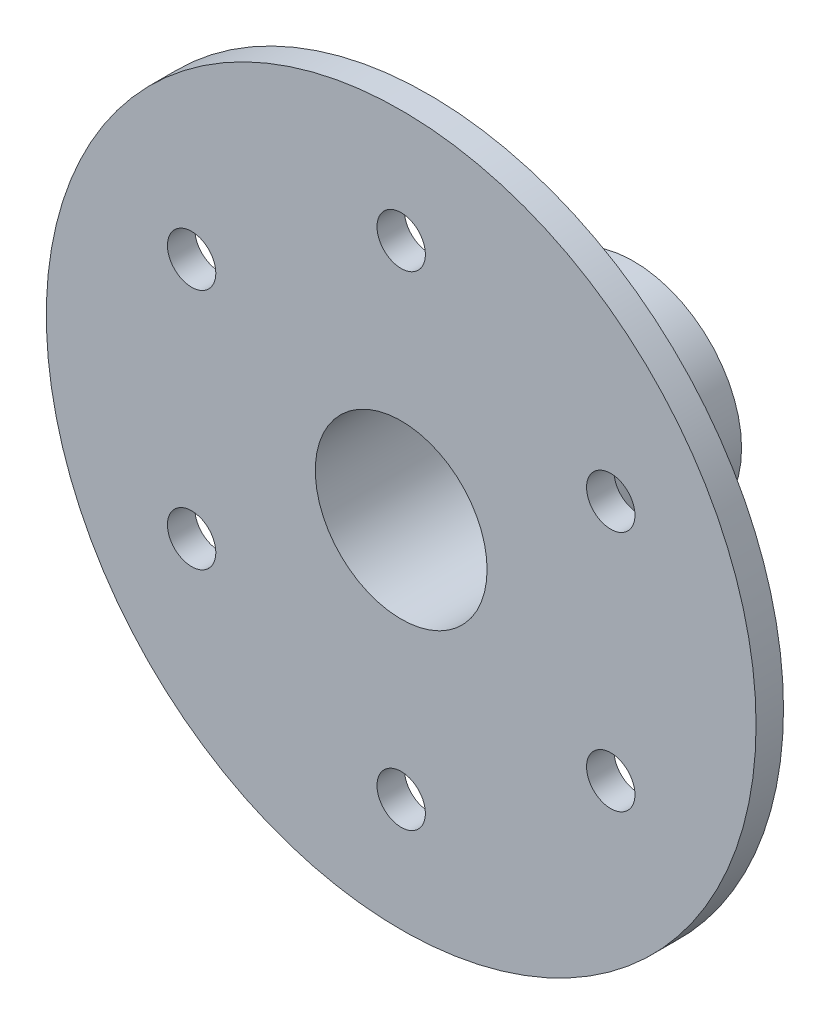
ISO-10303-21;
HEADER;
FILE_DESCRIPTION(('STEP AP214'),'2;1');
FILE_NAME('part.step','',(''),(''),'','','');
FILE_SCHEMA(('AUTOMOTIVE_DESIGN { 1 0 10303 214 1 1 1 1 }'));
ENDSEC;
DATA;
#1=APPLICATION_CONTEXT('core data for automotive mechanical design processes');
#2=APPLICATION_PROTOCOL_DEFINITION('international standard','automotive_design',2000,#1);
#3=PRODUCT_CONTEXT('',#1,'mechanical');
#4=PRODUCT('Part','Part','',(#3));
#5=PRODUCT_RELATED_PRODUCT_CATEGORY('part','',(#4));
#6=PRODUCT_DEFINITION_FORMATION('','',#4);
#7=PRODUCT_DEFINITION_CONTEXT('part definition',#1,'design');
#8=PRODUCT_DEFINITION('design','',#6,#7);
#9=PRODUCT_DEFINITION_SHAPE('','',#8);
#10=(LENGTH_UNIT() NAMED_UNIT(*) SI_UNIT(.MILLI.,.METRE.));
#11=(NAMED_UNIT(*) PLANE_ANGLE_UNIT() SI_UNIT($,.RADIAN.));
#12=(NAMED_UNIT(*) SI_UNIT($,.STERADIAN.) SOLID_ANGLE_UNIT());
#13=UNCERTAINTY_MEASURE_WITH_UNIT(LENGTH_MEASURE(1.E-05),#10,'distance_accuracy_value','');
#14=(GEOMETRIC_REPRESENTATION_CONTEXT(3) GLOBAL_UNCERTAINTY_ASSIGNED_CONTEXT((#13)) GLOBAL_UNIT_ASSIGNED_CONTEXT((#10,
#11,#12)) REPRESENTATION_CONTEXT('',''));
#15=CARTESIAN_POINT('',(0.,0.,0.));
#16=DIRECTION('',(0.,0.,1.));
#17=DIRECTION('',(1.,0.,0.));
#18=AXIS2_PLACEMENT_3D('',#15,#16,#17);
#19=CARTESIAN_POINT('',(0.,0.,0.));
#20=DIRECTION('',(0.,0.,1.));
#21=DIRECTION('',(1.,0.,0.));
#22=AXIS2_PLACEMENT_3D('',#19,#20,#21);
#23=PLANE('',#22);
#24=CARTESIAN_POINT('',(0.,0.,0.));
#25=DIRECTION('',(0.,0.,1.));
#26=DIRECTION('',(1.,0.,0.));
#27=AXIS2_PLACEMENT_3D('',#24,#25,#26);
#28=CIRCLE('',#27,13.4);
#29=CARTESIAN_POINT('',(13.4,0.,0.));
#30=VERTEX_POINT('',#29);
#31=EDGE_CURVE('E36',#30,#30,#28,.T.);
#32=ORIENTED_EDGE('',*,*,#31,.F.);
#33=EDGE_LOOP('',(#32));
#34=FACE_BOUND('',#33,.T.);
#35=CARTESIAN_POINT('',(0.,0.,0.));
#36=DIRECTION('',(0.,0.,1.));
#37=DIRECTION('',(1.,0.,0.));
#38=AXIS2_PLACEMENT_3D('',#35,#36,#37);
#39=CIRCLE('',#38,10.65);
#40=CARTESIAN_POINT('',(10.65,0.,0.));
#41=VERTEX_POINT('',#40);
#42=EDGE_CURVE('E43',#41,#41,#39,.T.);
#43=ORIENTED_EDGE('',*,*,#42,.T.);
#44=EDGE_LOOP('',(#43));
#45=FACE_BOUND('',#44,.T.);
#46=ADVANCED_FACE('F32',(#34,#45),#23,.F.);
#47=CARTESIAN_POINT('',(0.,0.,25.4));
#48=DIRECTION('',(0.,0.,-1.));
#49=DIRECTION('',(-1.,0.,0.));
#50=AXIS2_PLACEMENT_3D('',#47,#48,#49);
#51=CYLINDRICAL_SURFACE('',#50,13.4);
#52=CARTESIAN_POINT('',(0.,0.,25.4));
#53=DIRECTION('',(0.,0.,1.));
#54=DIRECTION('',(1.,0.,0.));
#55=AXIS2_PLACEMENT_3D('',#52,#53,#54);
#56=CIRCLE('',#55,13.4);
#57=CARTESIAN_POINT('',(13.4,0.,25.4));
#58=VERTEX_POINT('',#57);
#59=EDGE_CURVE('E10',#58,#58,#56,.T.);
#60=ORIENTED_EDGE('',*,*,#59,.F.);
#61=EDGE_LOOP('',(#60));
#62=FACE_BOUND('',#61,.T.);
#63=ORIENTED_EDGE('',*,*,#31,.T.);
#64=EDGE_LOOP('',(#63));
#65=FACE_BOUND('',#64,.T.);
#66=ADVANCED_FACE('F34',(#62,#65),#51,.T.);
#67=CARTESIAN_POINT('',(0.,0.,25.4));
#68=DIRECTION('',(0.,0.,-1.));
#69=DIRECTION('',(-1.,0.,0.));
#70=AXIS2_PLACEMENT_3D('',#67,#68,#69);
#71=CYLINDRICAL_SURFACE('',#70,10.65);
#72=ORIENTED_EDGE('',*,*,#42,.F.);
#73=EDGE_LOOP('',(#72));
#74=FACE_BOUND('',#73,.T.);
#75=CARTESIAN_POINT('',(0.,0.,28.8));
#76=DIRECTION('',(0.,0.,1.));
#77=DIRECTION('',(1.,0.,0.));
#78=AXIS2_PLACEMENT_3D('',#75,#76,#77);
#79=CIRCLE('',#78,10.6500000000001);
#80=CARTESIAN_POINT('',(10.6500000000001,0.,28.8));
#81=VERTEX_POINT('',#80);
#82=EDGE_CURVE('E51',#81,#81,#79,.T.);
#83=ORIENTED_EDGE('',*,*,#82,.T.);
#84=EDGE_LOOP('',(#83));
#85=FACE_BOUND('',#84,.T.);
#86=ADVANCED_FACE('F99',(#74,#85),#71,.F.);
#87=CARTESIAN_POINT('',(0.,0.,28.8));
#88=DIRECTION('',(0.,0.,1.));
#89=DIRECTION('',(1.,0.,0.));
#90=AXIS2_PLACEMENT_3D('',#87,#88,#89);
#91=PLANE('',#90);
#92=CARTESIAN_POINT('',(-25.98076211353,-15.0000000000015,28.8));
#93=DIRECTION('',(0.,0.,1.));
#94=DIRECTION('',(1.,0.,0.));
#95=AXIS2_PLACEMENT_3D('',#92,#93,#94);
#96=CIRCLE('',#95,3.00000000000316);
#97=CARTESIAN_POINT('',(-22.9807621135268,-15.0000000000015,28.8));
#98=VERTEX_POINT('',#97);
#99=EDGE_CURVE('E78',#98,#98,#96,.T.);
#100=ORIENTED_EDGE('',*,*,#99,.F.);
#101=EDGE_LOOP('',(#100));
#102=FACE_BOUND('',#101,.T.);
#103=CARTESIAN_POINT('',(25.9807621135357,-14.9999999999986,28.8));
#104=DIRECTION('',(0.,0.,1.));
#105=DIRECTION('',(1.,0.,0.));
#106=AXIS2_PLACEMENT_3D('',#103,#104,#105);
#107=CIRCLE('',#106,3.00000000000215);
#108=CARTESIAN_POINT('',(28.9807621135379,-14.9999999999986,28.8));
#109=VERTEX_POINT('',#108);
#110=EDGE_CURVE('E66',#109,#109,#107,.T.);
#111=ORIENTED_EDGE('',*,*,#110,.F.);
#112=EDGE_LOOP('',(#111));
#113=FACE_BOUND('',#112,.T.);
#114=CARTESIAN_POINT('',(25.9807621135344,15.0000000000014,28.8));
#115=DIRECTION('',(0.,0.,1.));
#116=DIRECTION('',(1.,0.,0.));
#117=AXIS2_PLACEMENT_3D('',#114,#115,#116);
#118=CIRCLE('',#117,3.00000000000046);
#119=CARTESIAN_POINT('',(28.9807621135349,15.0000000000014,28.8));
#120=VERTEX_POINT('',#119);
#121=EDGE_CURVE('E56',#120,#120,#118,.T.);
#122=ORIENTED_EDGE('',*,*,#121,.F.);
#123=EDGE_LOOP('',(#122));
#124=FACE_BOUND('',#123,.T.);
#125=CARTESIAN_POINT('',(0.,0.,28.8));
#126=DIRECTION('',(0.,0.,1.));
#127=DIRECTION('',(1.,0.,0.));
#128=AXIS2_PLACEMENT_3D('',#125,#126,#127);
#129=CIRCLE('',#128,44.);
#130=CARTESIAN_POINT('',(44.,0.,28.8));
#131=VERTEX_POINT('',#130);
#132=EDGE_CURVE('E47',#131,#131,#129,.T.);
#133=ORIENTED_EDGE('',*,*,#132,.T.);
#134=EDGE_LOOP('',(#133));
#135=FACE_BOUND('',#134,.T.);
#136=ORIENTED_EDGE('',*,*,#82,.F.);
#137=EDGE_LOOP('',(#136));
#138=FACE_BOUND('',#137,.T.);
#139=CARTESIAN_POINT('',(3.33066907387547E-13,29.9999999999998,28.7999999999998));
#140=DIRECTION('',(0.,0.,1.));
#141=DIRECTION('',(1.,0.,0.));
#142=AXIS2_PLACEMENT_3D('',#139,#140,#141);
#143=CIRCLE('',#142,3.);
#144=CARTESIAN_POINT('',(3.00000000000033,29.9999999999998,28.7999999999998));
#145=VERTEX_POINT('',#144);
#146=EDGE_CURVE('E60',#145,#145,#143,.T.);
#147=ORIENTED_EDGE('',*,*,#146,.F.);
#148=EDGE_LOOP('',(#147));
#149=FACE_BOUND('',#148,.T.);
#150=CARTESIAN_POINT('',(3.44169137633799E-12,-30.0000000000001,28.8));
#151=DIRECTION('',(0.,0.,1.));
#152=DIRECTION('',(1.,0.,0.));
#153=AXIS2_PLACEMENT_3D('',#150,#151,#152);
#154=CIRCLE('',#153,3.00000000000345);
#155=CARTESIAN_POINT('',(3.0000000000069,-30.0000000000001,28.8));
#156=VERTEX_POINT('',#155);
#157=EDGE_CURVE('E72',#156,#156,#154,.T.);
#158=ORIENTED_EDGE('',*,*,#157,.F.);
#159=EDGE_LOOP('',(#158));
#160=FACE_BOUND('',#159,.T.);
#161=CARTESIAN_POINT('',(-25.9807621135323,14.9999999999985,28.8));
#162=DIRECTION('',(0.,0.,1.));
#163=DIRECTION('',(1.,0.,0.));
#164=AXIS2_PLACEMENT_3D('',#161,#162,#163);
#165=CIRCLE('',#164,3.0000000000016);
#166=CARTESIAN_POINT('',(-22.9807621135307,14.9999999999985,28.8));
#167=VERTEX_POINT('',#166);
#168=EDGE_CURVE('E84',#167,#167,#165,.T.);
#169=ORIENTED_EDGE('',*,*,#168,.F.);
#170=EDGE_LOOP('',(#169));
#171=FACE_BOUND('',#170,.T.);
#172=ADVANCED_FACE('F96',(#102,#113,#124,#135,#138,#149,#160,#171),#91,.T.);
#173=CARTESIAN_POINT('',(0.,0.,25.4));
#174=DIRECTION('',(0.,0.,1.));
#175=DIRECTION('',(1.,0.,0.));
#176=AXIS2_PLACEMENT_3D('',#173,#174,#175);
#177=PLANE('',#176);
#178=ORIENTED_EDGE('',*,*,#59,.T.);
#179=EDGE_LOOP('',(#178));
#180=FACE_BOUND('',#179,.T.);
#181=CARTESIAN_POINT('',(0.,0.,25.4));
#182=DIRECTION('',(0.,0.,1.));
#183=DIRECTION('',(1.,0.,0.));
#184=AXIS2_PLACEMENT_3D('',#181,#182,#183);
#185=CIRCLE('',#184,44.);
#186=CARTESIAN_POINT('',(44.,0.,25.4));
#187=VERTEX_POINT('',#186);
#188=EDGE_CURVE('E48',#187,#187,#185,.T.);
#189=ORIENTED_EDGE('',*,*,#188,.F.);
#190=EDGE_LOOP('',(#189));
#191=FACE_BOUND('',#190,.T.);
#192=CARTESIAN_POINT('',(25.9807621135344,15.0000000000014,25.3999999999999));
#193=DIRECTION('',(0.,0.,1.));
#194=DIRECTION('',(1.,0.,0.));
#195=AXIS2_PLACEMENT_3D('',#192,#193,#194);
#196=CIRCLE('',#195,3.00000000000046);
#197=CARTESIAN_POINT('',(28.9807621135349,15.0000000000014,25.3999999999999));
#198=VERTEX_POINT('',#197);
#199=EDGE_CURVE('E57',#198,#198,#196,.T.);
#200=ORIENTED_EDGE('',*,*,#199,.T.);
#201=EDGE_LOOP('',(#200));
#202=FACE_BOUND('',#201,.T.);
#203=CARTESIAN_POINT('',(4.44089209850063E-13,29.9999999999999,25.3999999999998));
#204=DIRECTION('',(0.,0.,1.));
#205=DIRECTION('',(1.,0.,0.));
#206=AXIS2_PLACEMENT_3D('',#203,#204,#205);
#207=CIRCLE('',#206,3.);
#208=CARTESIAN_POINT('',(3.00000000000044,29.9999999999999,25.3999999999998));
#209=VERTEX_POINT('',#208);
#210=EDGE_CURVE('E63',#209,#209,#207,.T.);
#211=ORIENTED_EDGE('',*,*,#210,.T.);
#212=EDGE_LOOP('',(#211));
#213=FACE_BOUND('',#212,.T.);
#214=CARTESIAN_POINT('',(25.9807621135357,-14.9999999999986,25.4));
#215=DIRECTION('',(0.,0.,1.));
#216=DIRECTION('',(1.,0.,0.));
#217=AXIS2_PLACEMENT_3D('',#214,#215,#216);
#218=CIRCLE('',#217,3.00000000000215);
#219=CARTESIAN_POINT('',(28.9807621135379,-14.9999999999986,25.4));
#220=VERTEX_POINT('',#219);
#221=EDGE_CURVE('E69',#220,#220,#218,.T.);
#222=ORIENTED_EDGE('',*,*,#221,.T.);
#223=EDGE_LOOP('',(#222));
#224=FACE_BOUND('',#223,.T.);
#225=CARTESIAN_POINT('',(3.44169137633799E-12,-30.0000000000001,25.4));
#226=DIRECTION('',(0.,0.,1.));
#227=DIRECTION('',(1.,0.,0.));
#228=AXIS2_PLACEMENT_3D('',#225,#226,#227);
#229=CIRCLE('',#228,3.00000000000345);
#230=CARTESIAN_POINT('',(3.0000000000069,-30.0000000000001,25.4));
#231=VERTEX_POINT('',#230);
#232=EDGE_CURVE('E75',#231,#231,#229,.T.);
#233=ORIENTED_EDGE('',*,*,#232,.T.);
#234=EDGE_LOOP('',(#233));
#235=FACE_BOUND('',#234,.T.);
#236=CARTESIAN_POINT('',(-25.9807621135302,-15.0000000000017,25.3999999999999));
#237=DIRECTION('',(0.,0.,1.));
#238=DIRECTION('',(1.,0.,0.));
#239=AXIS2_PLACEMENT_3D('',#236,#237,#238);
#240=CIRCLE('',#239,3.00000000000316);
#241=CARTESIAN_POINT('',(-22.980762113527,-15.0000000000017,25.3999999999999));
#242=VERTEX_POINT('',#241);
#243=EDGE_CURVE('E81',#242,#242,#240,.T.);
#244=ORIENTED_EDGE('',*,*,#243,.T.);
#245=EDGE_LOOP('',(#244));
#246=FACE_BOUND('',#245,.T.);
#247=CARTESIAN_POINT('',(-25.9807621135322,14.9999999999984,25.4));
#248=DIRECTION('',(0.,0.,1.));
#249=DIRECTION('',(1.,0.,0.));
#250=AXIS2_PLACEMENT_3D('',#247,#248,#249);
#251=CIRCLE('',#250,3.0000000000016);
#252=CARTESIAN_POINT('',(-22.9807621135306,14.9999999999984,25.4));
#253=VERTEX_POINT('',#252);
#254=EDGE_CURVE('E87',#253,#253,#251,.T.);
#255=ORIENTED_EDGE('',*,*,#254,.T.);
#256=EDGE_LOOP('',(#255));
#257=FACE_BOUND('',#256,.T.);
#258=ADVANCED_FACE('F98',(#180,#191,#202,#213,#224,#235,#246,#257),#177,.F.);
#259=CARTESIAN_POINT('',(0.,0.,28.8));
#260=DIRECTION('',(0.,0.,-1.));
#261=DIRECTION('',(-1.,0.,0.));
#262=AXIS2_PLACEMENT_3D('',#259,#260,#261);
#263=CYLINDRICAL_SURFACE('',#262,44.);
#264=ORIENTED_EDGE('',*,*,#132,.F.);
#265=EDGE_LOOP('',(#264));
#266=FACE_BOUND('',#265,.T.);
#267=ORIENTED_EDGE('',*,*,#188,.T.);
#268=EDGE_LOOP('',(#267));
#269=FACE_BOUND('',#268,.T.);
#270=ADVANCED_FACE('F106',(#266,#269),#263,.T.);
#271=CARTESIAN_POINT('',(25.9807621135344,15.0000000000014,28.8));
#272=DIRECTION('',(0.,0.,-1.));
#273=DIRECTION('',(-1.,0.,0.));
#274=AXIS2_PLACEMENT_3D('',#271,#272,#273);
#275=CYLINDRICAL_SURFACE('',#274,3.00000000000046);
#276=ORIENTED_EDGE('',*,*,#121,.T.);
#277=EDGE_LOOP('',(#276));
#278=FACE_BOUND('',#277,.T.);
#279=ORIENTED_EDGE('',*,*,#199,.F.);
#280=EDGE_LOOP('',(#279));
#281=FACE_BOUND('',#280,.T.);
#282=ADVANCED_FACE('F123',(#278,#281),#275,.F.);
#283=CARTESIAN_POINT('',(3.33066907387547E-13,29.9999999999998,28.7999999999998));
#284=DIRECTION('',(0.,0.,-1.));
#285=DIRECTION('',(-1.,0.,0.));
#286=AXIS2_PLACEMENT_3D('',#283,#284,#285);
#287=CYLINDRICAL_SURFACE('',#286,3.);
#288=ORIENTED_EDGE('',*,*,#146,.T.);
#289=EDGE_LOOP('',(#288));
#290=FACE_BOUND('',#289,.T.);
#291=ORIENTED_EDGE('',*,*,#210,.F.);
#292=EDGE_LOOP('',(#291));
#293=FACE_BOUND('',#292,.T.);
#294=ADVANCED_FACE('F128',(#290,#293),#287,.F.);
#295=CARTESIAN_POINT('',(25.9807621135357,-14.9999999999986,28.8));
#296=DIRECTION('',(0.,0.,-1.));
#297=DIRECTION('',(-1.,0.,0.));
#298=AXIS2_PLACEMENT_3D('',#295,#296,#297);
#299=CYLINDRICAL_SURFACE('',#298,3.00000000000215);
#300=ORIENTED_EDGE('',*,*,#110,.T.);
#301=EDGE_LOOP('',(#300));
#302=FACE_BOUND('',#301,.T.);
#303=ORIENTED_EDGE('',*,*,#221,.F.);
#304=EDGE_LOOP('',(#303));
#305=FACE_BOUND('',#304,.T.);
#306=ADVANCED_FACE('F158',(#302,#305),#299,.F.);
#307=CARTESIAN_POINT('',(3.44169137633799E-12,-30.0000000000001,28.8));
#308=DIRECTION('',(0.,0.,-1.));
#309=DIRECTION('',(-1.,0.,0.));
#310=AXIS2_PLACEMENT_3D('',#307,#308,#309);
#311=CYLINDRICAL_SURFACE('',#310,3.00000000000345);
#312=ORIENTED_EDGE('',*,*,#157,.T.);
#313=EDGE_LOOP('',(#312));
#314=FACE_BOUND('',#313,.T.);
#315=ORIENTED_EDGE('',*,*,#232,.F.);
#316=EDGE_LOOP('',(#315));
#317=FACE_BOUND('',#316,.T.);
#318=ADVANCED_FACE('F152',(#314,#317),#311,.F.);
#319=CARTESIAN_POINT('',(-25.98076211353,-15.0000000000015,28.8));
#320=DIRECTION('',(0.,0.,-1.));
#321=DIRECTION('',(-1.,0.,0.));
#322=AXIS2_PLACEMENT_3D('',#319,#320,#321);
#323=CYLINDRICAL_SURFACE('',#322,3.00000000000316);
#324=ORIENTED_EDGE('',*,*,#99,.T.);
#325=EDGE_LOOP('',(#324));
#326=FACE_BOUND('',#325,.T.);
#327=ORIENTED_EDGE('',*,*,#243,.F.);
#328=EDGE_LOOP('',(#327));
#329=FACE_BOUND('',#328,.T.);
#330=ADVANCED_FACE('F147',(#326,#329),#323,.F.);
#331=CARTESIAN_POINT('',(-25.9807621135323,14.9999999999985,28.8));
#332=DIRECTION('',(0.,0.,-1.));
#333=DIRECTION('',(-1.,0.,0.));
#334=AXIS2_PLACEMENT_3D('',#331,#332,#333);
#335=CYLINDRICAL_SURFACE('',#334,3.0000000000016);
#336=ORIENTED_EDGE('',*,*,#168,.T.);
#337=EDGE_LOOP('',(#336));
#338=FACE_BOUND('',#337,.T.);
#339=ORIENTED_EDGE('',*,*,#254,.F.);
#340=EDGE_LOOP('',(#339));
#341=FACE_BOUND('',#340,.T.);
#342=ADVANCED_FACE('F93',(#338,#341),#335,.F.);
#343=CLOSED_SHELL('',(#46,#66,#86,#172,#258,#270,#282,#294,#306,#318,#330,#342));
#344=MANIFOLD_SOLID_BREP('B2',#343);
#345=ADVANCED_BREP_SHAPE_REPRESENTATION('',(#18,#344),#14);
#346=SHAPE_DEFINITION_REPRESENTATION(#9,#345);
ENDSEC;
END-ISO-10303-21;
